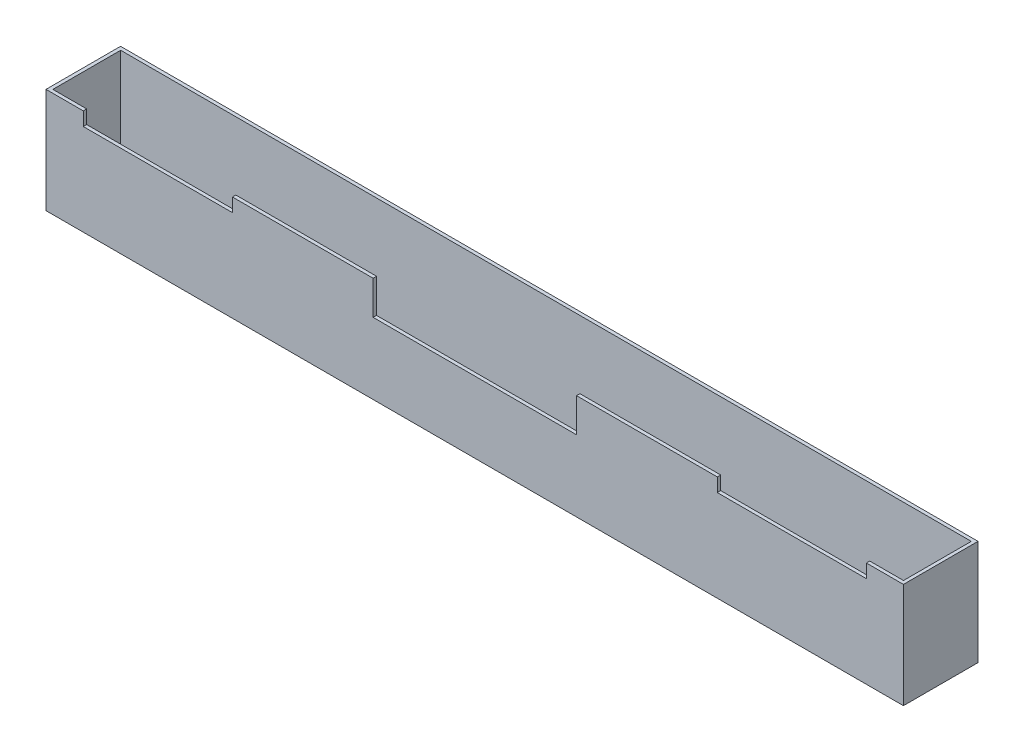
ISO-10303-21;
HEADER;
FILE_DESCRIPTION(('STEP AP214'),'2;1');
FILE_NAME('part.step','',(''),(''),'','','');
FILE_SCHEMA(('AUTOMOTIVE_DESIGN { 1 0 10303 214 1 1 1 1 }'));
ENDSEC;
DATA;
#1=APPLICATION_CONTEXT('core data for automotive mechanical design processes');
#2=APPLICATION_PROTOCOL_DEFINITION('international standard','automotive_design',2000,#1);
#3=PRODUCT_CONTEXT('',#1,'mechanical');
#4=PRODUCT('Part','Part','',(#3));
#5=PRODUCT_RELATED_PRODUCT_CATEGORY('part','',(#4));
#6=PRODUCT_DEFINITION_FORMATION('','',#4);
#7=PRODUCT_DEFINITION_CONTEXT('part definition',#1,'design');
#8=PRODUCT_DEFINITION('design','',#6,#7);
#9=PRODUCT_DEFINITION_SHAPE('','',#8);
#10=(LENGTH_UNIT() NAMED_UNIT(*) SI_UNIT(.MILLI.,.METRE.));
#11=(NAMED_UNIT(*) PLANE_ANGLE_UNIT() SI_UNIT($,.RADIAN.));
#12=(NAMED_UNIT(*) SI_UNIT($,.STERADIAN.) SOLID_ANGLE_UNIT());
#13=UNCERTAINTY_MEASURE_WITH_UNIT(LENGTH_MEASURE(1.E-05),#10,'distance_accuracy_value','');
#14=(GEOMETRIC_REPRESENTATION_CONTEXT(3) GLOBAL_UNCERTAINTY_ASSIGNED_CONTEXT((#13)) GLOBAL_UNIT_ASSIGNED_CONTEXT((#10,
#11,#12)) REPRESENTATION_CONTEXT('',''));
#15=CARTESIAN_POINT('',(0.,0.,0.));
#16=DIRECTION('',(0.,0.,1.));
#17=DIRECTION('',(1.,0.,0.));
#18=AXIS2_PLACEMENT_3D('',#15,#16,#17);
#19=CARTESIAN_POINT('',(401.447,98.425,69.85));
#20=DIRECTION('',(0.,-1.,0.));
#21=DIRECTION('',(1.,0.,0.));
#22=AXIS2_PLACEMENT_3D('',#19,#20,#21);
#23=PLANE('',#22);
#24=DIRECTION('',(-1.,0.,0.));
#25=VECTOR('',#24,1.);
#26=CARTESIAN_POINT('',(401.447,98.425,69.85));
#27=LINE('',#26,#25);
#28=CARTESIAN_POINT('',(-366.776,98.425,69.85));
#29=VERTEX_POINT('',#28);
#30=CARTESIAN_POINT('',(-401.701,98.4249999999999,69.85));
#31=VERTEX_POINT('',#30);
#32=EDGE_CURVE('E279',#29,#31,#27,.T.);
#33=ORIENTED_EDGE('',*,*,#32,.F.);
#34=DIRECTION('',(0.,0.,-1.));
#35=VECTOR('',#34,1.);
#36=CARTESIAN_POINT('',(-366.776,98.4249999999999,69.85));
#37=LINE('',#36,#35);
#38=CARTESIAN_POINT('',(-366.776,98.4249999999999,66.6749999999999));
#39=VERTEX_POINT('',#38);
#40=EDGE_CURVE('E179',#29,#39,#37,.T.);
#41=ORIENTED_EDGE('',*,*,#40,.T.);
#42=DIRECTION('',(1.,0.,0.));
#43=VECTOR('',#42,1.);
#44=CARTESIAN_POINT('',(-398.4625,98.425,66.675));
#45=LINE('',#44,#43);
#46=CARTESIAN_POINT('',(-398.4625,98.425,66.675));
#47=VERTEX_POINT('',#46);
#48=EDGE_CURVE('E259',#47,#39,#45,.T.);
#49=ORIENTED_EDGE('',*,*,#48,.F.);
#50=DIRECTION('',(0.,0.,1.));
#51=VECTOR('',#50,1.);
#52=CARTESIAN_POINT('',(-398.4625,98.425,3.17499999999995));
#53=LINE('',#52,#51);
#54=CARTESIAN_POINT('',(-398.4625,98.425,3.17499999999995));
#55=VERTEX_POINT('',#54);
#56=EDGE_CURVE('E255',#55,#47,#53,.T.);
#57=ORIENTED_EDGE('',*,*,#56,.F.);
#58=DIRECTION('',(-1.,0.,0.));
#59=VECTOR('',#58,1.);
#60=CARTESIAN_POINT('',(-398.4625,98.425,3.17499999999995));
#61=LINE('',#60,#59);
#62=CARTESIAN_POINT('',(398.3355,98.425,3.17499999999996));
#63=VERTEX_POINT('',#62);
#64=EDGE_CURVE('E252',#63,#55,#61,.T.);
#65=ORIENTED_EDGE('',*,*,#64,.F.);
#66=DIRECTION('',(0.,0.,-1.));
#67=VECTOR('',#66,1.);
#68=CARTESIAN_POINT('',(398.3355,98.425,3.17499999999995));
#69=LINE('',#68,#67);
#70=CARTESIAN_POINT('',(398.3355,98.425,66.675));
#71=VERTEX_POINT('',#70);
#72=EDGE_CURVE('E242',#71,#63,#69,.T.);
#73=ORIENTED_EDGE('',*,*,#72,.F.);
#74=CARTESIAN_POINT('',(366.776,98.4249999999999,66.6749999999999));
#75=VERTEX_POINT('',#74);
#76=EDGE_CURVE('E258',#75,#71,#45,.T.);
#77=ORIENTED_EDGE('',*,*,#76,.F.);
#78=DIRECTION('',(0.,0.,1.));
#79=VECTOR('',#78,1.);
#80=CARTESIAN_POINT('',(366.776,98.425,69.85));
#81=LINE('',#80,#79);
#82=CARTESIAN_POINT('',(366.776,98.425,69.85));
#83=VERTEX_POINT('',#82);
#84=EDGE_CURVE('E238',#75,#83,#81,.T.);
#85=ORIENTED_EDGE('',*,*,#84,.T.);
#86=CARTESIAN_POINT('',(401.447,98.425,69.85));
#87=VERTEX_POINT('',#86);
#88=EDGE_CURVE('E280',#87,#83,#27,.T.);
#89=ORIENTED_EDGE('',*,*,#88,.F.);
#90=DIRECTION('',(0.,0.,-1.));
#91=VECTOR('',#90,1.);
#92=CARTESIAN_POINT('',(401.447,98.425,69.85));
#93=LINE('',#92,#91);
#94=CARTESIAN_POINT('',(401.447,98.425,0.));
#95=VERTEX_POINT('',#94);
#96=EDGE_CURVE('E299',#87,#95,#93,.T.);
#97=ORIENTED_EDGE('',*,*,#96,.T.);
#98=DIRECTION('',(-1.,0.,0.));
#99=VECTOR('',#98,1.);
#100=CARTESIAN_POINT('',(401.447,98.425,0.));
#101=LINE('',#100,#99);
#102=CARTESIAN_POINT('',(-401.701,98.4249999999999,0.));
#103=VERTEX_POINT('',#102);
#104=EDGE_CURVE('E289',#95,#103,#101,.T.);
#105=ORIENTED_EDGE('',*,*,#104,.T.);
#106=DIRECTION('',(0.,0.,-1.));
#107=VECTOR('',#106,1.);
#108=CARTESIAN_POINT('',(-401.701,98.4249999999999,69.85));
#109=LINE('',#108,#107);
#110=EDGE_CURVE('E296',#31,#103,#109,.T.);
#111=ORIENTED_EDGE('',*,*,#110,.F.);
#112=EDGE_LOOP('',(#33,#41,#49,#57,#65,#73,#77,#85,#89,#97,#105,#111));
#113=FACE_BOUND('',#112,.T.);
#114=ADVANCED_FACE('F36',(#113),#23,.F.);
#115=CARTESIAN_POINT('',(227.076,98.425,69.85));
#116=VERTEX_POINT('',#115);
#117=CARTESIAN_POINT('',(95.25,98.425,69.85));
#118=VERTEX_POINT('',#117);
#119=EDGE_CURVE('E284',#116,#118,#27,.T.);
#120=ORIENTED_EDGE('',*,*,#119,.F.);
#121=DIRECTION('',(0.,0.,-1.));
#122=VECTOR('',#121,1.);
#123=CARTESIAN_POINT('',(227.076,98.425,69.85));
#124=LINE('',#123,#122);
#125=CARTESIAN_POINT('',(227.076,98.4249999999999,66.6749999999999));
#126=VERTEX_POINT('',#125);
#127=EDGE_CURVE('E235',#116,#126,#124,.T.);
#128=ORIENTED_EDGE('',*,*,#127,.T.);
#129=CARTESIAN_POINT('',(95.25,98.4249999999999,66.6749999999999));
#130=VERTEX_POINT('',#129);
#131=EDGE_CURVE('E315',#130,#126,#45,.T.);
#132=ORIENTED_EDGE('',*,*,#131,.F.);
#133=DIRECTION('',(0.,0.,1.));
#134=VECTOR('',#133,1.);
#135=CARTESIAN_POINT('',(95.25,98.425,69.85));
#136=LINE('',#135,#134);
#137=EDGE_CURVE('E232',#130,#118,#136,.T.);
#138=ORIENTED_EDGE('',*,*,#137,.T.);
#139=EDGE_LOOP('',(#120,#128,#132,#138));
#140=FACE_BOUND('',#139,.T.);
#141=ADVANCED_FACE('F322',(#140),#23,.F.);
#142=CARTESIAN_POINT('',(401.447,0.,69.85));
#143=DIRECTION('',(-1.,0.,0.));
#144=DIRECTION('',(0.,0.,1.));
#145=AXIS2_PLACEMENT_3D('',#142,#143,#144);
#146=PLANE('',#145);
#147=DIRECTION('',(0.,1.,0.));
#148=VECTOR('',#147,1.);
#149=CARTESIAN_POINT('',(401.447,0.,0.));
#150=LINE('',#149,#148);
#151=CARTESIAN_POINT('',(401.447,0.,0.));
#152=VERTEX_POINT('',#151);
#153=EDGE_CURVE('E273',#152,#95,#150,.T.);
#154=ORIENTED_EDGE('',*,*,#153,.T.);
#155=ORIENTED_EDGE('',*,*,#96,.F.);
#156=DIRECTION('',(0.,1.,0.));
#157=VECTOR('',#156,1.);
#158=CARTESIAN_POINT('',(401.447,0.,69.85));
#159=LINE('',#158,#157);
#160=CARTESIAN_POINT('',(401.447,0.,69.85));
#161=VERTEX_POINT('',#160);
#162=EDGE_CURVE('E276',#161,#87,#159,.T.);
#163=ORIENTED_EDGE('',*,*,#162,.F.);
#164=DIRECTION('',(0.,0.,-1.));
#165=VECTOR('',#164,1.);
#166=CARTESIAN_POINT('',(401.447,0.,69.85));
#167=LINE('',#166,#165);
#168=EDGE_CURVE('E302',#161,#152,#167,.T.);
#169=ORIENTED_EDGE('',*,*,#168,.T.);
#170=EDGE_LOOP('',(#154,#155,#163,#169));
#171=FACE_BOUND('',#170,.T.);
#172=ADVANCED_FACE('F38',(#171),#146,.F.);
#173=CARTESIAN_POINT('',(-95.25,98.425,69.85));
#174=VERTEX_POINT('',#173);
#175=CARTESIAN_POINT('',(-227.076,98.425,69.85));
#176=VERTEX_POINT('',#175);
#177=EDGE_CURVE('E349',#174,#176,#27,.T.);
#178=ORIENTED_EDGE('',*,*,#177,.F.);
#179=DIRECTION('',(0.,0.,-1.));
#180=VECTOR('',#179,1.);
#181=CARTESIAN_POINT('',(-95.25,98.4249999999999,69.85));
#182=LINE('',#181,#180);
#183=CARTESIAN_POINT('',(-95.25,98.425,66.6749999999999));
#184=VERTEX_POINT('',#183);
#185=EDGE_CURVE('E229',#174,#184,#182,.T.);
#186=ORIENTED_EDGE('',*,*,#185,.T.);
#187=CARTESIAN_POINT('',(-227.076,98.4249999999999,66.6749999999999));
#188=VERTEX_POINT('',#187);
#189=EDGE_CURVE('E263',#188,#184,#45,.T.);
#190=ORIENTED_EDGE('',*,*,#189,.F.);
#191=DIRECTION('',(0.,0.,1.));
#192=VECTOR('',#191,1.);
#193=CARTESIAN_POINT('',(-227.076,98.4249999999999,69.85));
#194=LINE('',#193,#192);
#195=EDGE_CURVE('E226',#188,#176,#194,.T.);
#196=ORIENTED_EDGE('',*,*,#195,.T.);
#197=EDGE_LOOP('',(#178,#186,#190,#196));
#198=FACE_BOUND('',#197,.T.);
#199=ADVANCED_FACE('F368',(#198),#23,.F.);
#200=CARTESIAN_POINT('',(-401.701,98.4249999999999,69.85));
#201=DIRECTION('',(1.,0.,0.));
#202=DIRECTION('',(0.,0.,-1.));
#203=AXIS2_PLACEMENT_3D('',#200,#201,#202);
#204=PLANE('',#203);
#205=DIRECTION('',(0.,-1.,0.));
#206=VECTOR('',#205,1.);
#207=CARTESIAN_POINT('',(-401.701,98.4249999999999,0.));
#208=LINE('',#207,#206);
#209=CARTESIAN_POINT('',(-401.701,0.,0.));
#210=VERTEX_POINT('',#209);
#211=EDGE_CURVE('E291',#103,#210,#208,.T.);
#212=ORIENTED_EDGE('',*,*,#211,.T.);
#213=DIRECTION('',(0.,0.,-1.));
#214=VECTOR('',#213,1.);
#215=CARTESIAN_POINT('',(-401.701,0.,69.85));
#216=LINE('',#215,#214);
#217=CARTESIAN_POINT('',(-401.701,0.,69.85));
#218=VERTEX_POINT('',#217);
#219=EDGE_CURVE('E287',#218,#210,#216,.T.);
#220=ORIENTED_EDGE('',*,*,#219,.F.);
#221=DIRECTION('',(0.,-1.,0.));
#222=VECTOR('',#221,1.);
#223=CARTESIAN_POINT('',(-401.701,98.4249999999999,69.85));
#224=LINE('',#223,#222);
#225=EDGE_CURVE('E283',#31,#218,#224,.T.);
#226=ORIENTED_EDGE('',*,*,#225,.F.);
#227=ORIENTED_EDGE('',*,*,#110,.T.);
#228=EDGE_LOOP('',(#212,#220,#226,#227));
#229=FACE_BOUND('',#228,.T.);
#230=ADVANCED_FACE('F387',(#229),#204,.F.);
#231=CARTESIAN_POINT('',(-401.701,0.,69.85));
#232=DIRECTION('',(0.,1.,0.));
#233=DIRECTION('',(0.,0.,1.));
#234=AXIS2_PLACEMENT_3D('',#231,#232,#233);
#235=PLANE('',#234);
#236=DIRECTION('',(1.,0.,0.));
#237=VECTOR('',#236,1.);
#238=CARTESIAN_POINT('',(-401.701,0.,0.));
#239=LINE('',#238,#237);
#240=EDGE_CURVE('E277',#210,#152,#239,.T.);
#241=ORIENTED_EDGE('',*,*,#240,.T.);
#242=ORIENTED_EDGE('',*,*,#168,.F.);
#243=DIRECTION('',(1.,0.,0.));
#244=VECTOR('',#243,1.);
#245=CARTESIAN_POINT('',(-366.776,0.,69.85));
#246=LINE('',#245,#244);
#247=EDGE_CURVE('E274',#218,#161,#246,.T.);
#248=ORIENTED_EDGE('',*,*,#247,.F.);
#249=ORIENTED_EDGE('',*,*,#219,.T.);
#250=EDGE_LOOP('',(#241,#242,#248,#249));
#251=FACE_BOUND('',#250,.T.);
#252=ADVANCED_FACE('F392',(#251),#235,.F.);
#253=CARTESIAN_POINT('',(0.,0.,69.85));
#254=DIRECTION('',(0.,0.,1.));
#255=DIRECTION('',(1.,0.,0.));
#256=AXIS2_PLACEMENT_3D('',#253,#254,#255);
#257=PLANE('',#256);
#258=DIRECTION('',(0.,1.,0.));
#259=VECTOR('',#258,1.);
#260=CARTESIAN_POINT('',(366.776,207.999074197158,69.85));
#261=LINE('',#260,#259);
#262=CARTESIAN_POINT('',(366.776,85.725,69.85));
#263=VERTEX_POINT('',#262);
#264=EDGE_CURVE('E183',#263,#83,#261,.T.);
#265=ORIENTED_EDGE('',*,*,#264,.F.);
#266=DIRECTION('',(1.,0.,0.));
#267=VECTOR('',#266,1.);
#268=CARTESIAN_POINT('',(227.076,85.725,69.85));
#269=LINE('',#268,#267);
#270=CARTESIAN_POINT('',(227.076,85.725,69.85));
#271=VERTEX_POINT('',#270);
#272=EDGE_CURVE('E213',#271,#263,#269,.T.);
#273=ORIENTED_EDGE('',*,*,#272,.F.);
#274=DIRECTION('',(0.,-1.,0.));
#275=VECTOR('',#274,1.);
#276=CARTESIAN_POINT('',(227.076,98.425,69.85));
#277=LINE('',#276,#275);
#278=EDGE_CURVE('E211',#116,#271,#277,.T.);
#279=ORIENTED_EDGE('',*,*,#278,.F.);
#280=ORIENTED_EDGE('',*,*,#119,.T.);
#281=DIRECTION('',(0.,1.,0.));
#282=VECTOR('',#281,1.);
#283=CARTESIAN_POINT('',(95.25,98.425,69.85));
#284=LINE('',#283,#282);
#285=CARTESIAN_POINT('',(95.25,66.675,69.85));
#286=VERTEX_POINT('',#285);
#287=EDGE_CURVE('E209',#286,#118,#284,.T.);
#288=ORIENTED_EDGE('',*,*,#287,.F.);
#289=DIRECTION('',(1.,0.,0.));
#290=VECTOR('',#289,1.);
#291=CARTESIAN_POINT('',(95.25,66.675,69.85));
#292=LINE('',#291,#290);
#293=CARTESIAN_POINT('',(-95.25,66.675,69.85));
#294=VERTEX_POINT('',#293);
#295=EDGE_CURVE('E206',#294,#286,#292,.T.);
#296=ORIENTED_EDGE('',*,*,#295,.F.);
#297=DIRECTION('',(0.,-1.,0.));
#298=VECTOR('',#297,1.);
#299=CARTESIAN_POINT('',(-95.25,98.425,69.85));
#300=LINE('',#299,#298);
#301=EDGE_CURVE('E199',#174,#294,#300,.T.);
#302=ORIENTED_EDGE('',*,*,#301,.F.);
#303=ORIENTED_EDGE('',*,*,#177,.T.);
#304=DIRECTION('',(0.,1.,0.));
#305=VECTOR('',#304,1.);
#306=CARTESIAN_POINT('',(-227.076,189.981198681943,69.85));
#307=LINE('',#306,#305);
#308=CARTESIAN_POINT('',(-227.076,85.725,69.85));
#309=VERTEX_POINT('',#308);
#310=EDGE_CURVE('E197',#309,#176,#307,.T.);
#311=ORIENTED_EDGE('',*,*,#310,.F.);
#312=DIRECTION('',(1.,0.,0.));
#313=VECTOR('',#312,1.);
#314=CARTESIAN_POINT('',(-366.776,85.725,69.85));
#315=LINE('',#314,#313);
#316=CARTESIAN_POINT('',(-366.776,85.725,69.85));
#317=VERTEX_POINT('',#316);
#318=EDGE_CURVE('E188',#317,#309,#315,.T.);
#319=ORIENTED_EDGE('',*,*,#318,.F.);
#320=DIRECTION('',(0.,-1.,0.));
#321=VECTOR('',#320,1.);
#322=CARTESIAN_POINT('',(-366.776,225.818081793461,69.85));
#323=LINE('',#322,#321);
#324=EDGE_CURVE('E173',#29,#317,#323,.T.);
#325=ORIENTED_EDGE('',*,*,#324,.F.);
#326=ORIENTED_EDGE('',*,*,#32,.T.);
#327=ORIENTED_EDGE('',*,*,#225,.T.);
#328=ORIENTED_EDGE('',*,*,#247,.T.);
#329=ORIENTED_EDGE('',*,*,#162,.T.);
#330=ORIENTED_EDGE('',*,*,#88,.T.);
#331=EDGE_LOOP('',(#265,#273,#279,#280,#288,#296,#302,#303,#311,#319,#325,#326,#327,#328,#329,#330));
#332=FACE_BOUND('',#331,.T.);
#333=ADVANCED_FACE('F195',(#332),#257,.T.);
#334=CARTESIAN_POINT('',(0.,0.,0.));
#335=DIRECTION('',(0.,0.,1.));
#336=DIRECTION('',(1.,0.,0.));
#337=AXIS2_PLACEMENT_3D('',#334,#335,#336);
#338=PLANE('',#337);
#339=ORIENTED_EDGE('',*,*,#153,.F.);
#340=ORIENTED_EDGE('',*,*,#240,.F.);
#341=ORIENTED_EDGE('',*,*,#211,.F.);
#342=ORIENTED_EDGE('',*,*,#104,.F.);
#343=EDGE_LOOP('',(#339,#340,#341,#342));
#344=FACE_BOUND('',#343,.T.);
#345=ADVANCED_FACE('F406',(#344),#338,.F.);
#346=CARTESIAN_POINT('',(398.3355,-799.324278878103,3.17499999999995));
#347=DIRECTION('',(1.,0.,0.));
#348=DIRECTION('',(0.,0.,-1.));
#349=AXIS2_PLACEMENT_3D('',#346,#347,#348);
#350=PLANE('',#349);
#351=DIRECTION('',(0.,0.,1.));
#352=VECTOR('',#351,1.);
#353=CARTESIAN_POINT('',(398.3355,3.17500000000004,3.17499999999995));
#354=LINE('',#353,#352);
#355=CARTESIAN_POINT('',(398.3355,3.17500000000004,3.17499999999995));
#356=VERTEX_POINT('',#355);
#357=CARTESIAN_POINT('',(398.3355,3.17500000000004,66.675));
#358=VERTEX_POINT('',#357);
#359=EDGE_CURVE('E248',#356,#358,#354,.T.);
#360=ORIENTED_EDGE('',*,*,#359,.T.);
#361=DIRECTION('',(0.,1.,0.));
#362=VECTOR('',#361,1.);
#363=CARTESIAN_POINT('',(398.3355,-799.324278878103,66.675));
#364=LINE('',#363,#362);
#365=EDGE_CURVE('E246',#358,#71,#364,.T.);
#366=ORIENTED_EDGE('',*,*,#365,.T.);
#367=ORIENTED_EDGE('',*,*,#72,.T.);
#368=DIRECTION('',(0.,1.,0.));
#369=VECTOR('',#368,1.);
#370=CARTESIAN_POINT('',(398.3355,-799.324278878103,3.17499999999995));
#371=LINE('',#370,#369);
#372=EDGE_CURVE('E262',#356,#63,#371,.T.);
#373=ORIENTED_EDGE('',*,*,#372,.F.);
#374=EDGE_LOOP('',(#360,#366,#367,#373));
#375=FACE_BOUND('',#374,.T.);
#376=ADVANCED_FACE('F330',(#375),#350,.F.);
#377=CARTESIAN_POINT('',(-398.4625,-799.324278878103,66.675));
#378=DIRECTION('',(0.,0.,1.));
#379=DIRECTION('',(1.,0.,0.));
#380=AXIS2_PLACEMENT_3D('',#377,#378,#379);
#381=PLANE('',#380);
#382=DIRECTION('',(-1.,0.,0.));
#383=VECTOR('',#382,1.);
#384=CARTESIAN_POINT('',(227.076,85.725,66.6749999999999));
#385=LINE('',#384,#383);
#386=CARTESIAN_POINT('',(366.776,85.725,66.6749999999999));
#387=VERTEX_POINT('',#386);
#388=CARTESIAN_POINT('',(227.076,85.7250000000001,66.675));
#389=VERTEX_POINT('',#388);
#390=EDGE_CURVE('E360',#387,#389,#385,.T.);
#391=ORIENTED_EDGE('',*,*,#390,.F.);
#392=DIRECTION('',(0.,1.,0.));
#393=VECTOR('',#392,1.);
#394=CARTESIAN_POINT('',(366.776,-799.324278878103,66.675));
#395=LINE('',#394,#393);
#396=EDGE_CURVE('E12',#387,#75,#395,.T.);
#397=ORIENTED_EDGE('',*,*,#396,.T.);
#398=ORIENTED_EDGE('',*,*,#76,.T.);
#399=ORIENTED_EDGE('',*,*,#365,.F.);
#400=DIRECTION('',(-1.,0.,0.));
#401=VECTOR('',#400,1.);
#402=CARTESIAN_POINT('',(-398.4625,3.17500000000004,66.675));
#403=LINE('',#402,#401);
#404=CARTESIAN_POINT('',(-398.4625,3.17500000000004,66.675));
#405=VERTEX_POINT('',#404);
#406=EDGE_CURVE('E245',#358,#405,#403,.T.);
#407=ORIENTED_EDGE('',*,*,#406,.T.);
#408=DIRECTION('',(0.,1.,0.));
#409=VECTOR('',#408,1.);
#410=CARTESIAN_POINT('',(-398.4625,-799.324278878103,66.675));
#411=LINE('',#410,#409);
#412=EDGE_CURVE('E266',#405,#47,#411,.T.);
#413=ORIENTED_EDGE('',*,*,#412,.T.);
#414=ORIENTED_EDGE('',*,*,#48,.T.);
#415=DIRECTION('',(0.,1.,0.));
#416=VECTOR('',#415,1.);
#417=CARTESIAN_POINT('',(-366.776,225.818081793461,66.6749999999999));
#418=LINE('',#417,#416);
#419=CARTESIAN_POINT('',(-366.776,85.725,66.6749999999999));
#420=VERTEX_POINT('',#419);
#421=EDGE_CURVE('E202',#420,#39,#418,.T.);
#422=ORIENTED_EDGE('',*,*,#421,.F.);
#423=DIRECTION('',(-1.,0.,0.));
#424=VECTOR('',#423,1.);
#425=CARTESIAN_POINT('',(-366.776,85.725,66.6749999999999));
#426=LINE('',#425,#424);
#427=CARTESIAN_POINT('',(-227.076,85.7250000000001,66.675));
#428=VERTEX_POINT('',#427);
#429=EDGE_CURVE('E191',#428,#420,#426,.T.);
#430=ORIENTED_EDGE('',*,*,#429,.F.);
#431=DIRECTION('',(0.,1.,0.));
#432=VECTOR('',#431,1.);
#433=CARTESIAN_POINT('',(-227.076,-799.324278878103,66.675));
#434=LINE('',#433,#432);
#435=EDGE_CURVE('E305',#428,#188,#434,.T.);
#436=ORIENTED_EDGE('',*,*,#435,.T.);
#437=ORIENTED_EDGE('',*,*,#189,.T.);
#438=DIRECTION('',(0.,1.,0.));
#439=VECTOR('',#438,1.);
#440=CARTESIAN_POINT('',(-95.25,98.425,66.6749999999999));
#441=LINE('',#440,#439);
#442=CARTESIAN_POINT('',(-95.25,66.675,66.675));
#443=VERTEX_POINT('',#442);
#444=EDGE_CURVE('E219',#443,#184,#441,.T.);
#445=ORIENTED_EDGE('',*,*,#444,.F.);
#446=DIRECTION('',(-1.,0.,0.));
#447=VECTOR('',#446,1.);
#448=CARTESIAN_POINT('',(95.25,66.675,66.6749999999999));
#449=LINE('',#448,#447);
#450=CARTESIAN_POINT('',(95.25,66.675,66.6749999999999));
#451=VERTEX_POINT('',#450);
#452=EDGE_CURVE('E317',#451,#443,#449,.T.);
#453=ORIENTED_EDGE('',*,*,#452,.F.);
#454=DIRECTION('',(0.,1.,0.));
#455=VECTOR('',#454,1.);
#456=CARTESIAN_POINT('',(95.25,-799.324278878103,66.675));
#457=LINE('',#456,#455);
#458=EDGE_CURVE('E44',#451,#130,#457,.T.);
#459=ORIENTED_EDGE('',*,*,#458,.T.);
#460=ORIENTED_EDGE('',*,*,#131,.T.);
#461=DIRECTION('',(0.,1.,0.));
#462=VECTOR('',#461,1.);
#463=CARTESIAN_POINT('',(227.076,98.425,66.6749999999999));
#464=LINE('',#463,#462);
#465=EDGE_CURVE('E361',#389,#126,#464,.T.);
#466=ORIENTED_EDGE('',*,*,#465,.F.);
#467=EDGE_LOOP('',(#391,#397,#398,#399,#407,#413,#414,#422,#430,#436,#437,#445,#453,#459,#460,#466));
#468=FACE_BOUND('',#467,.T.);
#469=ADVANCED_FACE('F313',(#468),#381,.F.);
#470=CARTESIAN_POINT('',(-398.4625,-799.324278878103,3.17499999999995));
#471=DIRECTION('',(-1.,0.,0.));
#472=DIRECTION('',(0.,0.,1.));
#473=AXIS2_PLACEMENT_3D('',#470,#471,#472);
#474=PLANE('',#473);
#475=DIRECTION('',(0.,0.,-1.));
#476=VECTOR('',#475,1.);
#477=CARTESIAN_POINT('',(-398.4625,3.17500000000004,3.17499999999995));
#478=LINE('',#477,#476);
#479=CARTESIAN_POINT('',(-398.4625,3.17500000000004,3.17499999999995));
#480=VERTEX_POINT('',#479);
#481=EDGE_CURVE('E243',#405,#480,#478,.T.);
#482=ORIENTED_EDGE('',*,*,#481,.T.);
#483=DIRECTION('',(0.,1.,0.));
#484=VECTOR('',#483,1.);
#485=CARTESIAN_POINT('',(-398.4625,-799.324278878103,3.17499999999995));
#486=LINE('',#485,#484);
#487=EDGE_CURVE('E268',#480,#55,#486,.T.);
#488=ORIENTED_EDGE('',*,*,#487,.T.);
#489=ORIENTED_EDGE('',*,*,#56,.T.);
#490=ORIENTED_EDGE('',*,*,#412,.F.);
#491=EDGE_LOOP('',(#482,#488,#489,#490));
#492=FACE_BOUND('',#491,.T.);
#493=ADVANCED_FACE('F346',(#492),#474,.F.);
#494=CARTESIAN_POINT('',(-398.4625,-799.324278878103,3.17499999999995));
#495=DIRECTION('',(0.,0.,-1.));
#496=DIRECTION('',(-1.,0.,0.));
#497=AXIS2_PLACEMENT_3D('',#494,#495,#496);
#498=PLANE('',#497);
#499=DIRECTION('',(1.,0.,0.));
#500=VECTOR('',#499,1.);
#501=CARTESIAN_POINT('',(-398.4625,3.17500000000004,3.17499999999995));
#502=LINE('',#501,#500);
#503=EDGE_CURVE('E250',#480,#356,#502,.T.);
#504=ORIENTED_EDGE('',*,*,#503,.T.);
#505=ORIENTED_EDGE('',*,*,#372,.T.);
#506=ORIENTED_EDGE('',*,*,#64,.T.);
#507=ORIENTED_EDGE('',*,*,#487,.F.);
#508=EDGE_LOOP('',(#504,#505,#506,#507));
#509=FACE_BOUND('',#508,.T.);
#510=ADVANCED_FACE('F339',(#509),#498,.F.);
#511=CARTESIAN_POINT('',(-401.701,3.175,69.85));
#512=DIRECTION('',(0.,1.,0.));
#513=DIRECTION('',(0.,0.,1.));
#514=AXIS2_PLACEMENT_3D('',#511,#512,#513);
#515=PLANE('',#514);
#516=ORIENTED_EDGE('',*,*,#359,.F.);
#517=ORIENTED_EDGE('',*,*,#503,.F.);
#518=ORIENTED_EDGE('',*,*,#481,.F.);
#519=ORIENTED_EDGE('',*,*,#406,.F.);
#520=EDGE_LOOP('',(#516,#517,#518,#519));
#521=FACE_BOUND('',#520,.T.);
#522=ADVANCED_FACE('F343',(#521),#515,.T.);
#523=CARTESIAN_POINT('',(-366.776,85.725,-683.941451449554));
#524=DIRECTION('',(0.,-1.,0.));
#525=DIRECTION('',(0.,0.,-1.));
#526=AXIS2_PLACEMENT_3D('',#523,#524,#525);
#527=PLANE('',#526);
#528=ORIENTED_EDGE('',*,*,#429,.T.);
#529=DIRECTION('',(0.,0.,1.));
#530=VECTOR('',#529,1.);
#531=CARTESIAN_POINT('',(-366.776,85.725,-683.941451449554));
#532=LINE('',#531,#530);
#533=EDGE_CURVE('E176',#420,#317,#532,.T.);
#534=ORIENTED_EDGE('',*,*,#533,.T.);
#535=ORIENTED_EDGE('',*,*,#318,.T.);
#536=DIRECTION('',(0.,0.,1.));
#537=VECTOR('',#536,1.);
#538=CARTESIAN_POINT('',(-227.076,85.725,-683.941451449554));
#539=LINE('',#538,#537);
#540=EDGE_CURVE('E192',#428,#309,#539,.T.);
#541=ORIENTED_EDGE('',*,*,#540,.F.);
#542=EDGE_LOOP('',(#528,#534,#535,#541));
#543=FACE_BOUND('',#542,.T.);
#544=ADVANCED_FACE('F187',(#543),#527,.F.);
#545=CARTESIAN_POINT('',(-227.076,189.981198681943,-683.941451449554));
#546=DIRECTION('',(1.,0.,0.));
#547=DIRECTION('',(0.,0.,-1.));
#548=AXIS2_PLACEMENT_3D('',#545,#546,#547);
#549=PLANE('',#548);
#550=ORIENTED_EDGE('',*,*,#435,.F.);
#551=ORIENTED_EDGE('',*,*,#540,.T.);
#552=ORIENTED_EDGE('',*,*,#310,.T.);
#553=ORIENTED_EDGE('',*,*,#195,.F.);
#554=EDGE_LOOP('',(#550,#551,#552,#553));
#555=FACE_BOUND('',#554,.T.);
#556=ADVANCED_FACE('F371',(#555),#549,.F.);
#557=CARTESIAN_POINT('',(-366.776,225.818081793461,-683.941451449554));
#558=DIRECTION('',(-1.,0.,0.));
#559=DIRECTION('',(0.,0.,1.));
#560=AXIS2_PLACEMENT_3D('',#557,#558,#559);
#561=PLANE('',#560);
#562=ORIENTED_EDGE('',*,*,#324,.T.);
#563=ORIENTED_EDGE('',*,*,#533,.F.);
#564=ORIENTED_EDGE('',*,*,#421,.T.);
#565=ORIENTED_EDGE('',*,*,#40,.F.);
#566=EDGE_LOOP('',(#562,#563,#564,#565));
#567=FACE_BOUND('',#566,.T.);
#568=ADVANCED_FACE('F175',(#567),#561,.F.);
#569=CARTESIAN_POINT('',(-95.25,98.425,-683.941451449554));
#570=DIRECTION('',(-1.,0.,0.));
#571=DIRECTION('',(0.,-1.,0.));
#572=AXIS2_PLACEMENT_3D('',#569,#570,#571);
#573=PLANE('',#572);
#574=ORIENTED_EDGE('',*,*,#301,.T.);
#575=DIRECTION('',(0.,0.,1.));
#576=VECTOR('',#575,1.);
#577=CARTESIAN_POINT('',(-95.25,66.675,-683.941451449554));
#578=LINE('',#577,#576);
#579=EDGE_CURVE('E59',#443,#294,#578,.T.);
#580=ORIENTED_EDGE('',*,*,#579,.F.);
#581=ORIENTED_EDGE('',*,*,#444,.T.);
#582=ORIENTED_EDGE('',*,*,#185,.F.);
#583=EDGE_LOOP('',(#574,#580,#581,#582));
#584=FACE_BOUND('',#583,.T.);
#585=ADVANCED_FACE('F365',(#584),#573,.F.);
#586=CARTESIAN_POINT('',(95.25,66.675,-683.941451449554));
#587=DIRECTION('',(0.,-1.,0.));
#588=DIRECTION('',(1.,0.,0.));
#589=AXIS2_PLACEMENT_3D('',#586,#587,#588);
#590=PLANE('',#589);
#591=ORIENTED_EDGE('',*,*,#452,.T.);
#592=ORIENTED_EDGE('',*,*,#579,.T.);
#593=ORIENTED_EDGE('',*,*,#295,.T.);
#594=DIRECTION('',(0.,0.,1.));
#595=VECTOR('',#594,1.);
#596=CARTESIAN_POINT('',(95.25,66.675,-683.941451449554));
#597=LINE('',#596,#595);
#598=EDGE_CURVE('E221',#451,#286,#597,.T.);
#599=ORIENTED_EDGE('',*,*,#598,.F.);
#600=EDGE_LOOP('',(#591,#592,#593,#599));
#601=FACE_BOUND('',#600,.T.);
#602=ADVANCED_FACE('F419',(#601),#590,.F.);
#603=CARTESIAN_POINT('',(95.25,98.425,-683.941451449554));
#604=DIRECTION('',(1.,0.,0.));
#605=DIRECTION('',(0.,0.,-1.));
#606=AXIS2_PLACEMENT_3D('',#603,#604,#605);
#607=PLANE('',#606);
#608=ORIENTED_EDGE('',*,*,#458,.F.);
#609=ORIENTED_EDGE('',*,*,#598,.T.);
#610=ORIENTED_EDGE('',*,*,#287,.T.);
#611=ORIENTED_EDGE('',*,*,#137,.F.);
#612=EDGE_LOOP('',(#608,#609,#610,#611));
#613=FACE_BOUND('',#612,.T.);
#614=ADVANCED_FACE('F412',(#613),#607,.F.);
#615=CARTESIAN_POINT('',(366.776,207.999074197158,-683.941451449554));
#616=DIRECTION('',(1.,0.,0.));
#617=DIRECTION('',(0.,0.,-1.));
#618=AXIS2_PLACEMENT_3D('',#615,#616,#617);
#619=PLANE('',#618);
#620=ORIENTED_EDGE('',*,*,#396,.F.);
#621=DIRECTION('',(0.,0.,1.));
#622=VECTOR('',#621,1.);
#623=CARTESIAN_POINT('',(366.776,85.725,-683.941451449554));
#624=LINE('',#623,#622);
#625=EDGE_CURVE('E217',#387,#263,#624,.T.);
#626=ORIENTED_EDGE('',*,*,#625,.T.);
#627=ORIENTED_EDGE('',*,*,#264,.T.);
#628=ORIENTED_EDGE('',*,*,#84,.F.);
#629=EDGE_LOOP('',(#620,#626,#627,#628));
#630=FACE_BOUND('',#629,.T.);
#631=ADVANCED_FACE('F410',(#630),#619,.F.);
#632=CARTESIAN_POINT('',(227.076,98.425,-683.941451449554));
#633=DIRECTION('',(-1.,0.,0.));
#634=DIRECTION('',(0.,0.,1.));
#635=AXIS2_PLACEMENT_3D('',#632,#633,#634);
#636=PLANE('',#635);
#637=ORIENTED_EDGE('',*,*,#278,.T.);
#638=DIRECTION('',(0.,0.,1.));
#639=VECTOR('',#638,1.);
#640=CARTESIAN_POINT('',(227.076,85.725,-683.941451449554));
#641=LINE('',#640,#639);
#642=EDGE_CURVE('E51',#389,#271,#641,.T.);
#643=ORIENTED_EDGE('',*,*,#642,.F.);
#644=ORIENTED_EDGE('',*,*,#465,.T.);
#645=ORIENTED_EDGE('',*,*,#127,.F.);
#646=EDGE_LOOP('',(#637,#643,#644,#645));
#647=FACE_BOUND('',#646,.T.);
#648=ADVANCED_FACE('F356',(#647),#636,.F.);
#649=CARTESIAN_POINT('',(227.076,85.725,-683.941451449554));
#650=DIRECTION('',(0.,-1.,0.));
#651=DIRECTION('',(1.,0.,0.));
#652=AXIS2_PLACEMENT_3D('',#649,#650,#651);
#653=PLANE('',#652);
#654=ORIENTED_EDGE('',*,*,#390,.T.);
#655=ORIENTED_EDGE('',*,*,#642,.T.);
#656=ORIENTED_EDGE('',*,*,#272,.T.);
#657=ORIENTED_EDGE('',*,*,#625,.F.);
#658=EDGE_LOOP('',(#654,#655,#656,#657));
#659=FACE_BOUND('',#658,.T.);
#660=ADVANCED_FACE('F358',(#659),#653,.F.);
#661=CLOSED_SHELL('',(#114,#141,#172,#199,#230,#252,#333,#345,#376,#469,#493,#510,#522,#544,
#556,#568,#585,#602,#614,#631,#648,#660));
#662=MANIFOLD_SOLID_BREP('B2',#661);
#663=ADVANCED_BREP_SHAPE_REPRESENTATION('',(#18,#662),#14);
#664=SHAPE_DEFINITION_REPRESENTATION(#9,#663);
ENDSEC;
END-ISO-10303-21;
